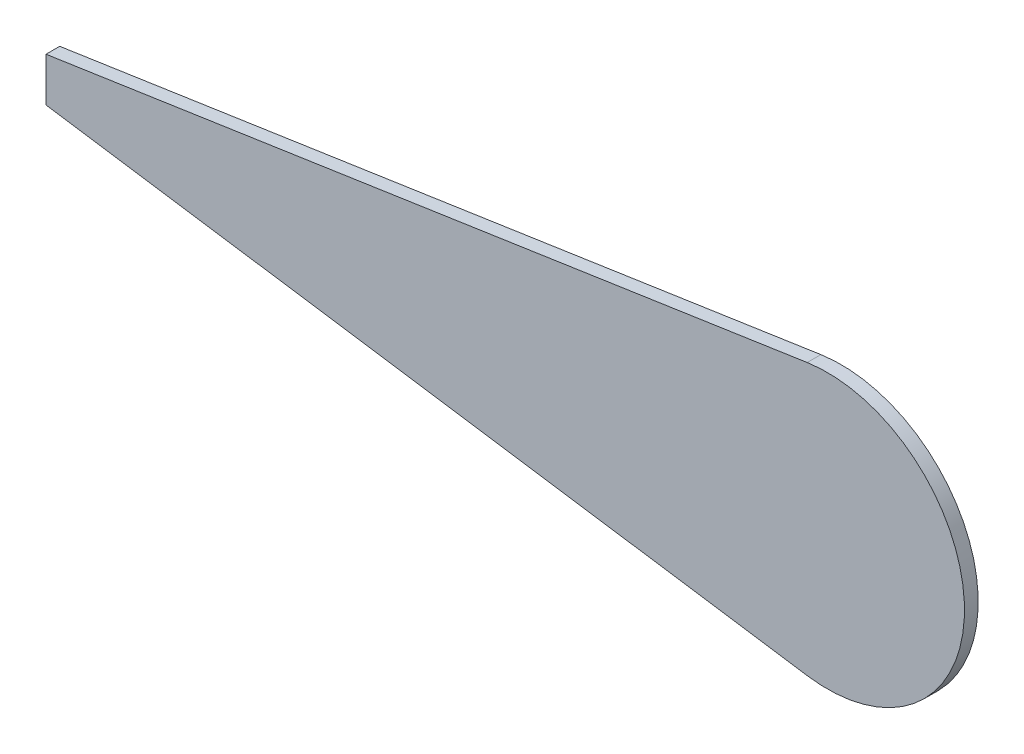
ISO-10303-21;
HEADER;
FILE_DESCRIPTION(('STEP AP214'),'2;1');
FILE_NAME('part.step','',(''),(''),'','','');
FILE_SCHEMA(('AUTOMOTIVE_DESIGN { 1 0 10303 214 1 1 1 1 }'));
ENDSEC;
DATA;
#1=APPLICATION_CONTEXT('core data for automotive mechanical design processes');
#2=APPLICATION_PROTOCOL_DEFINITION('international standard','automotive_design',2000,#1);
#3=PRODUCT_CONTEXT('',#1,'mechanical');
#4=PRODUCT('Part','Part','',(#3));
#5=PRODUCT_RELATED_PRODUCT_CATEGORY('part','',(#4));
#6=PRODUCT_DEFINITION_FORMATION('','',#4);
#7=PRODUCT_DEFINITION_CONTEXT('part definition',#1,'design');
#8=PRODUCT_DEFINITION('design','',#6,#7);
#9=PRODUCT_DEFINITION_SHAPE('','',#8);
#10=(LENGTH_UNIT() NAMED_UNIT(*) SI_UNIT(.MILLI.,.METRE.));
#11=(NAMED_UNIT(*) PLANE_ANGLE_UNIT() SI_UNIT($,.RADIAN.));
#12=(NAMED_UNIT(*) SI_UNIT($,.STERADIAN.) SOLID_ANGLE_UNIT());
#13=UNCERTAINTY_MEASURE_WITH_UNIT(LENGTH_MEASURE(1.E-05),#10,'distance_accuracy_value','');
#14=(GEOMETRIC_REPRESENTATION_CONTEXT(3) GLOBAL_UNCERTAINTY_ASSIGNED_CONTEXT((#13)) GLOBAL_UNIT_ASSIGNED_CONTEXT((#10,
#11,#12)) REPRESENTATION_CONTEXT('',''));
#15=CARTESIAN_POINT('',(0.,0.,0.));
#16=DIRECTION('',(0.,0.,1.));
#17=DIRECTION('',(1.,0.,0.));
#18=AXIS2_PLACEMENT_3D('',#15,#16,#17);
#19=CARTESIAN_POINT('',(33.138844977512,84.8361883098917,13.));
#20=DIRECTION('',(-1.,0.,0.));
#21=DIRECTION('',(0.,0.,1.));
#22=AXIS2_PLACEMENT_3D('',#19,#20,#21);
#23=PLANE('',#22);
#24=DIRECTION('',(0.,1.,0.));
#25=VECTOR('',#24,1.);
#26=CARTESIAN_POINT('',(33.138844977512,84.8361883098917,12.));
#27=LINE('',#26,#25);
#28=CARTESIAN_POINT('',(33.138844977512,84.8361883098917,12.));
#29=VERTEX_POINT('',#28);
#30=CARTESIAN_POINT('',(33.138844977512,88.0454271337105,12.));
#31=VERTEX_POINT('',#30);
#32=EDGE_CURVE('E102',#29,#31,#27,.T.);
#33=ORIENTED_EDGE('',*,*,#32,.F.);
#34=DIRECTION('',(0.,0.,-1.));
#35=VECTOR('',#34,1.);
#36=CARTESIAN_POINT('',(33.138844977512,84.8361883098917,13.));
#37=LINE('',#36,#35);
#38=CARTESIAN_POINT('',(33.138844977512,84.8361883098917,13.));
#39=VERTEX_POINT('',#38);
#40=EDGE_CURVE('E11',#39,#29,#37,.T.);
#41=ORIENTED_EDGE('',*,*,#40,.F.);
#42=DIRECTION('',(0.,1.,0.));
#43=VECTOR('',#42,1.);
#44=CARTESIAN_POINT('',(33.138844977512,84.8361883098917,13.));
#45=LINE('',#44,#43);
#46=CARTESIAN_POINT('',(33.138844977512,88.0454271337105,13.));
#47=VERTEX_POINT('',#46);
#48=EDGE_CURVE('E96',#39,#47,#45,.T.);
#49=ORIENTED_EDGE('',*,*,#48,.T.);
#50=DIRECTION('',(0.,0.,-1.));
#51=VECTOR('',#50,1.);
#52=CARTESIAN_POINT('',(33.138844977512,88.0454271337105,13.));
#53=LINE('',#52,#51);
#54=EDGE_CURVE('E41',#47,#31,#53,.T.);
#55=ORIENTED_EDGE('',*,*,#54,.T.);
#56=EDGE_LOOP('',(#33,#41,#49,#55));
#57=FACE_BOUND('',#56,.T.);
#58=ADVANCED_FACE('F38',(#57),#23,.T.);
#59=CARTESIAN_POINT('',(88.6628880066959,76.5503299264518,13.));
#60=DIRECTION('',(-0.147595697081619,-0.989047779534938,0.));
#61=DIRECTION('',(-0.989047779534938,0.147595697081619,0.));
#62=AXIS2_PLACEMENT_3D('',#59,#60,#61);
#63=PLANE('',#62);
#64=DIRECTION('',(-0.989047779534938,0.147595697081619,0.));
#65=VECTOR('',#64,1.);
#66=CARTESIAN_POINT('',(88.6628880066959,76.5503299264518,12.));
#67=LINE('',#66,#65);
#68=CARTESIAN_POINT('',(88.6628880066959,76.5503299264518,12.));
#69=VERTEX_POINT('',#68);
#70=EDGE_CURVE('E98',#69,#29,#67,.T.);
#71=ORIENTED_EDGE('',*,*,#70,.F.);
#72=DIRECTION('',(0.,0.,-1.));
#73=VECTOR('',#72,1.);
#74=CARTESIAN_POINT('',(88.6628880066959,76.5503299264518,13.));
#75=LINE('',#74,#73);
#76=CARTESIAN_POINT('',(88.6628880066959,76.5503299264518,13.));
#77=VERTEX_POINT('',#76);
#78=EDGE_CURVE('E47',#77,#69,#75,.T.);
#79=ORIENTED_EDGE('',*,*,#78,.F.);
#80=DIRECTION('',(-0.989047779534938,0.147595697081619,0.));
#81=VECTOR('',#80,1.);
#82=CARTESIAN_POINT('',(88.6628880066959,76.5503299264518,13.));
#83=LINE('',#82,#81);
#84=EDGE_CURVE('E93',#77,#39,#83,.T.);
#85=ORIENTED_EDGE('',*,*,#84,.T.);
#86=ORIENTED_EDGE('',*,*,#40,.T.);
#87=EDGE_LOOP('',(#71,#79,#85,#86));
#88=FACE_BOUND('',#87,.T.);
#89=ADVANCED_FACE('F112',(#88),#63,.T.);
#90=CARTESIAN_POINT('',(90.138844977512,86.4408077218012,13.));
#91=DIRECTION('',(0.,0.,-1.));
#92=DIRECTION('',(-1.,0.,0.));
#93=AXIS2_PLACEMENT_3D('',#90,#91,#92);
#94=CYLINDRICAL_SURFACE('',#93,10.);
#95=CARTESIAN_POINT('',(90.138844977512,86.4408077218012,12.));
#96=DIRECTION('',(0.,0.,-1.));
#97=DIRECTION('',(-1.,0.,0.));
#98=AXIS2_PLACEMENT_3D('',#95,#96,#97);
#99=CIRCLE('',#98,10.);
#100=CARTESIAN_POINT('',(88.6628880066958,96.3312855171506,12.));
#101=VERTEX_POINT('',#100);
#102=EDGE_CURVE('E88',#101,#69,#99,.T.);
#103=ORIENTED_EDGE('',*,*,#102,.F.);
#104=DIRECTION('',(0.,0.,-1.));
#105=VECTOR('',#104,1.);
#106=CARTESIAN_POINT('',(88.6628880066958,96.3312855171506,13.));
#107=LINE('',#106,#105);
#108=CARTESIAN_POINT('',(88.6628880066958,96.3312855171506,13.));
#109=VERTEX_POINT('',#108);
#110=EDGE_CURVE('E83',#109,#101,#107,.T.);
#111=ORIENTED_EDGE('',*,*,#110,.F.);
#112=CARTESIAN_POINT('',(90.138844977512,86.4408077218012,13.));
#113=DIRECTION('',(0.,0.,-1.));
#114=DIRECTION('',(-1.,0.,0.));
#115=AXIS2_PLACEMENT_3D('',#112,#113,#114);
#116=CIRCLE('',#115,10.);
#117=EDGE_CURVE('E86',#109,#77,#116,.T.);
#118=ORIENTED_EDGE('',*,*,#117,.T.);
#119=ORIENTED_EDGE('',*,*,#78,.T.);
#120=EDGE_LOOP('',(#103,#111,#118,#119));
#121=FACE_BOUND('',#120,.T.);
#122=ADVANCED_FACE('F85',(#121),#94,.T.);
#123=CARTESIAN_POINT('',(33.138844977512,88.0454271337105,13.));
#124=DIRECTION('',(-0.147595697081623,0.989047779534937,0.));
#125=DIRECTION('',(0.989047779534937,0.147595697081623,0.));
#126=AXIS2_PLACEMENT_3D('',#123,#124,#125);
#127=PLANE('',#126);
#128=DIRECTION('',(0.989047779534937,0.147595697081623,0.));
#129=VECTOR('',#128,1.);
#130=CARTESIAN_POINT('',(33.138844977512,88.0454271337105,12.));
#131=LINE('',#130,#129);
#132=EDGE_CURVE('E105',#31,#101,#131,.T.);
#133=ORIENTED_EDGE('',*,*,#132,.F.);
#134=ORIENTED_EDGE('',*,*,#54,.F.);
#135=DIRECTION('',(0.989047779534937,0.147595697081623,0.));
#136=VECTOR('',#135,1.);
#137=CARTESIAN_POINT('',(33.138844977512,88.0454271337105,13.));
#138=LINE('',#137,#136);
#139=EDGE_CURVE('E92',#47,#109,#138,.T.);
#140=ORIENTED_EDGE('',*,*,#139,.T.);
#141=ORIENTED_EDGE('',*,*,#110,.T.);
#142=EDGE_LOOP('',(#133,#134,#140,#141));
#143=FACE_BOUND('',#142,.T.);
#144=ADVANCED_FACE('F95',(#143),#127,.T.);
#145=CARTESIAN_POINT('',(90.138844977512,86.4408077218012,13.));
#146=DIRECTION('',(0.,0.,-1.));
#147=DIRECTION('',(-1.,0.,0.));
#148=AXIS2_PLACEMENT_3D('',#145,#146,#147);
#149=PLANE('',#148);
#150=ORIENTED_EDGE('',*,*,#48,.F.);
#151=ORIENTED_EDGE('',*,*,#84,.F.);
#152=ORIENTED_EDGE('',*,*,#117,.F.);
#153=ORIENTED_EDGE('',*,*,#139,.F.);
#154=EDGE_LOOP('',(#150,#151,#152,#153));
#155=FACE_BOUND('',#154,.T.);
#156=ADVANCED_FACE('F91',(#155),#149,.F.);
#157=CARTESIAN_POINT('',(90.138844977512,86.4408077218012,12.));
#158=DIRECTION('',(0.,0.,-1.));
#159=DIRECTION('',(-1.,0.,0.));
#160=AXIS2_PLACEMENT_3D('',#157,#158,#159);
#161=PLANE('',#160);
#162=ORIENTED_EDGE('',*,*,#32,.T.);
#163=ORIENTED_EDGE('',*,*,#132,.T.);
#164=ORIENTED_EDGE('',*,*,#102,.T.);
#165=ORIENTED_EDGE('',*,*,#70,.T.);
#166=EDGE_LOOP('',(#162,#163,#164,#165));
#167=FACE_BOUND('',#166,.T.);
#168=ADVANCED_FACE('F111',(#167),#161,.T.);
#169=CLOSED_SHELL('',(#58,#89,#122,#144,#156,#168));
#170=MANIFOLD_SOLID_BREP('B2',#169);
#171=ADVANCED_BREP_SHAPE_REPRESENTATION('',(#18,#170),#14);
#172=SHAPE_DEFINITION_REPRESENTATION(#9,#171);
ENDSEC;
END-ISO-10303-21;
